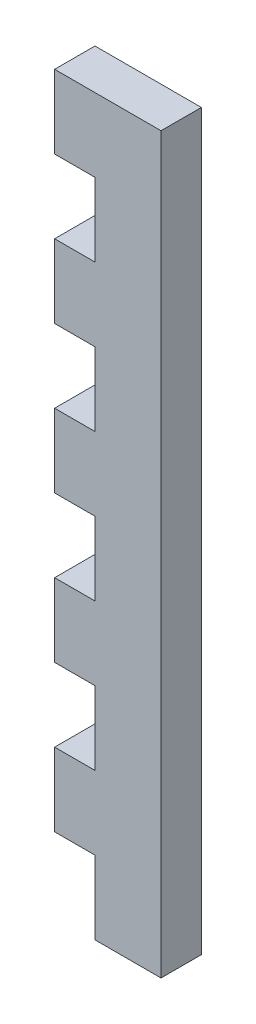
ISO-10303-21;
HEADER;
FILE_DESCRIPTION(('STEP AP214'),'2;1');
FILE_NAME('part.step','',(''),(''),'','','');
FILE_SCHEMA(('AUTOMOTIVE_DESIGN { 1 0 10303 214 1 1 1 1 }'));
ENDSEC;
DATA;
#1=APPLICATION_CONTEXT('core data for automotive mechanical design processes');
#2=APPLICATION_PROTOCOL_DEFINITION('international standard','automotive_design',2000,#1);
#3=PRODUCT_CONTEXT('',#1,'mechanical');
#4=PRODUCT('Part','Part','',(#3));
#5=PRODUCT_RELATED_PRODUCT_CATEGORY('part','',(#4));
#6=PRODUCT_DEFINITION_FORMATION('','',#4);
#7=PRODUCT_DEFINITION_CONTEXT('part definition',#1,'design');
#8=PRODUCT_DEFINITION('design','',#6,#7);
#9=PRODUCT_DEFINITION_SHAPE('','',#8);
#10=(LENGTH_UNIT() NAMED_UNIT(*) SI_UNIT(.MILLI.,.METRE.));
#11=(NAMED_UNIT(*) PLANE_ANGLE_UNIT() SI_UNIT($,.RADIAN.));
#12=(NAMED_UNIT(*) SI_UNIT($,.STERADIAN.) SOLID_ANGLE_UNIT());
#13=UNCERTAINTY_MEASURE_WITH_UNIT(LENGTH_MEASURE(1.E-05),#10,'distance_accuracy_value','');
#14=(GEOMETRIC_REPRESENTATION_CONTEXT(3) GLOBAL_UNCERTAINTY_ASSIGNED_CONTEXT((#13)) GLOBAL_UNIT_ASSIGNED_CONTEXT((#10,
#11,#12)) REPRESENTATION_CONTEXT('',''));
#15=CARTESIAN_POINT('',(0.,0.,0.));
#16=DIRECTION('',(0.,0.,1.));
#17=DIRECTION('',(1.,0.,0.));
#18=AXIS2_PLACEMENT_3D('',#15,#16,#17);
#19=CARTESIAN_POINT('',(0.,0.,5.5));
#20=DIRECTION('',(1.,0.,0.));
#21=DIRECTION('',(0.,1.,0.));
#22=AXIS2_PLACEMENT_3D('',#19,#20,#21);
#23=PLANE('',#22);
#24=DIRECTION('',(0.,-1.,0.));
#25=VECTOR('',#24,1.);
#26=CARTESIAN_POINT('',(0.,0.,0.));
#27=LINE('',#26,#25);
#28=CARTESIAN_POINT('',(0.,0.,0.));
#29=VERTEX_POINT('',#28);
#30=CARTESIAN_POINT('',(0.,-10.,0.));
#31=VERTEX_POINT('',#30);
#32=EDGE_CURVE('E203',#29,#31,#27,.T.);
#33=ORIENTED_EDGE('',*,*,#32,.T.);
#34=DIRECTION('',(0.,0.,1.));
#35=VECTOR('',#34,1.);
#36=CARTESIAN_POINT('',(0.,-10.,0.));
#37=LINE('',#36,#35);
#38=CARTESIAN_POINT('',(0.,-10.,5.5));
#39=VERTEX_POINT('',#38);
#40=EDGE_CURVE('E240',#31,#39,#37,.T.);
#41=ORIENTED_EDGE('',*,*,#40,.T.);
#42=DIRECTION('',(0.,-1.,0.));
#43=VECTOR('',#42,1.);
#44=CARTESIAN_POINT('',(0.,0.,5.5));
#45=LINE('',#44,#43);
#46=CARTESIAN_POINT('',(0.,0.,5.5));
#47=VERTEX_POINT('',#46);
#48=EDGE_CURVE('E242',#47,#39,#45,.T.);
#49=ORIENTED_EDGE('',*,*,#48,.F.);
#50=DIRECTION('',(0.,0.,-1.));
#51=VECTOR('',#50,1.);
#52=CARTESIAN_POINT('',(0.,0.,5.5));
#53=LINE('',#52,#51);
#54=EDGE_CURVE('E221',#47,#29,#53,.T.);
#55=ORIENTED_EDGE('',*,*,#54,.T.);
#56=EDGE_LOOP('',(#33,#41,#49,#55));
#57=FACE_BOUND('',#56,.T.);
#58=ADVANCED_FACE('F33',(#57),#23,.F.);
#59=CARTESIAN_POINT('',(0.,-40.,5.5));
#60=VERTEX_POINT('',#59);
#61=CARTESIAN_POINT('',(0.,-50.,5.5));
#62=VERTEX_POINT('',#61);
#63=EDGE_CURVE('E249',#60,#62,#45,.T.);
#64=ORIENTED_EDGE('',*,*,#63,.F.);
#65=DIRECTION('',(0.,0.,1.));
#66=VECTOR('',#65,1.);
#67=CARTESIAN_POINT('',(0.,-40.,0.));
#68=LINE('',#67,#66);
#69=CARTESIAN_POINT('',(0.,-40.,0.));
#70=VERTEX_POINT('',#69);
#71=EDGE_CURVE('E274',#70,#60,#68,.T.);
#72=ORIENTED_EDGE('',*,*,#71,.F.);
#73=CARTESIAN_POINT('',(0.,-50.,0.));
#74=VERTEX_POINT('',#73);
#75=EDGE_CURVE('E204',#70,#74,#27,.T.);
#76=ORIENTED_EDGE('',*,*,#75,.T.);
#77=DIRECTION('',(0.,0.,1.));
#78=VECTOR('',#77,1.);
#79=CARTESIAN_POINT('',(0.,-50.,0.));
#80=LINE('',#79,#78);
#81=EDGE_CURVE('E276',#74,#62,#80,.T.);
#82=ORIENTED_EDGE('',*,*,#81,.T.);
#83=EDGE_LOOP('',(#64,#72,#76,#82));
#84=FACE_BOUND('',#83,.T.);
#85=ADVANCED_FACE('F273',(#84),#23,.F.);
#86=CARTESIAN_POINT('',(0.,-60.,5.5));
#87=VERTEX_POINT('',#86);
#88=CARTESIAN_POINT('',(0.,-70.,5.5));
#89=VERTEX_POINT('',#88);
#90=EDGE_CURVE('E252',#87,#89,#45,.T.);
#91=ORIENTED_EDGE('',*,*,#90,.F.);
#92=DIRECTION('',(0.,0.,1.));
#93=VECTOR('',#92,1.);
#94=CARTESIAN_POINT('',(0.,-60.,0.));
#95=LINE('',#94,#93);
#96=CARTESIAN_POINT('',(0.,-60.,0.));
#97=VERTEX_POINT('',#96);
#98=EDGE_CURVE('E279',#97,#87,#95,.T.);
#99=ORIENTED_EDGE('',*,*,#98,.F.);
#100=CARTESIAN_POINT('',(0.,-70.,0.));
#101=VERTEX_POINT('',#100);
#102=EDGE_CURVE('E210',#97,#101,#27,.T.);
#103=ORIENTED_EDGE('',*,*,#102,.T.);
#104=DIRECTION('',(0.,0.,1.));
#105=VECTOR('',#104,1.);
#106=CARTESIAN_POINT('',(0.,-70.,0.));
#107=LINE('',#106,#105);
#108=EDGE_CURVE('E311',#101,#89,#107,.T.);
#109=ORIENTED_EDGE('',*,*,#108,.T.);
#110=EDGE_LOOP('',(#91,#99,#103,#109));
#111=FACE_BOUND('',#110,.T.);
#112=ADVANCED_FACE('F353',(#111),#23,.F.);
#113=CARTESIAN_POINT('',(0.,-80.,5.5));
#114=VERTEX_POINT('',#113);
#115=CARTESIAN_POINT('',(0.,-90.,5.5));
#116=VERTEX_POINT('',#115);
#117=EDGE_CURVE('E220',#114,#116,#45,.T.);
#118=ORIENTED_EDGE('',*,*,#117,.F.);
#119=DIRECTION('',(0.,0.,1.));
#120=VECTOR('',#119,1.);
#121=CARTESIAN_POINT('',(0.,-80.,0.));
#122=LINE('',#121,#120);
#123=CARTESIAN_POINT('',(0.,-80.,0.));
#124=VERTEX_POINT('',#123);
#125=EDGE_CURVE('E308',#124,#114,#122,.T.);
#126=ORIENTED_EDGE('',*,*,#125,.F.);
#127=CARTESIAN_POINT('',(0.,-90.,0.));
#128=VERTEX_POINT('',#127);
#129=EDGE_CURVE('E208',#124,#128,#27,.T.);
#130=ORIENTED_EDGE('',*,*,#129,.T.);
#131=DIRECTION('',(0.,0.,1.));
#132=VECTOR('',#131,1.);
#133=CARTESIAN_POINT('',(0.,-90.,0.));
#134=LINE('',#133,#132);
#135=EDGE_CURVE('E304',#128,#116,#134,.T.);
#136=ORIENTED_EDGE('',*,*,#135,.T.);
#137=EDGE_LOOP('',(#118,#126,#130,#136));
#138=FACE_BOUND('',#137,.T.);
#139=ADVANCED_FACE('F355',(#138),#23,.F.);
#140=CARTESIAN_POINT('',(0.,-20.,5.5));
#141=VERTEX_POINT('',#140);
#142=CARTESIAN_POINT('',(0.,-30.,5.5));
#143=VERTEX_POINT('',#142);
#144=EDGE_CURVE('E198',#141,#143,#45,.T.);
#145=ORIENTED_EDGE('',*,*,#144,.F.);
#146=DIRECTION('',(0.,0.,1.));
#147=VECTOR('',#146,1.);
#148=CARTESIAN_POINT('',(0.,-20.,0.));
#149=LINE('',#148,#147);
#150=CARTESIAN_POINT('',(0.,-20.,0.));
#151=VERTEX_POINT('',#150);
#152=EDGE_CURVE('E185',#151,#141,#149,.T.);
#153=ORIENTED_EDGE('',*,*,#152,.F.);
#154=CARTESIAN_POINT('',(0.,-30.,0.));
#155=VERTEX_POINT('',#154);
#156=EDGE_CURVE('E196',#151,#155,#27,.T.);
#157=ORIENTED_EDGE('',*,*,#156,.T.);
#158=DIRECTION('',(0.,0.,1.));
#159=VECTOR('',#158,1.);
#160=CARTESIAN_POINT('',(0.,-30.,0.));
#161=LINE('',#160,#159);
#162=EDGE_CURVE('E392',#155,#143,#161,.T.);
#163=ORIENTED_EDGE('',*,*,#162,.T.);
#164=EDGE_LOOP('',(#145,#153,#157,#163));
#165=FACE_BOUND('',#164,.T.);
#166=ADVANCED_FACE('F35',(#165),#23,.F.);
#167=CARTESIAN_POINT('',(0.,-100.,5.5));
#168=DIRECTION('',(0.,1.,0.));
#169=DIRECTION('',(0.,0.,1.));
#170=AXIS2_PLACEMENT_3D('',#167,#168,#169);
#171=PLANE('',#170);
#172=DIRECTION('',(1.,0.,0.));
#173=VECTOR('',#172,1.);
#174=CARTESIAN_POINT('',(0.,-100.,5.5));
#175=LINE('',#174,#173);
#176=CARTESIAN_POINT('',(5.50000000000001,-100.,5.5));
#177=VERTEX_POINT('',#176);
#178=CARTESIAN_POINT('',(14.5,-100.,5.5));
#179=VERTEX_POINT('',#178);
#180=EDGE_CURVE('E245',#177,#179,#175,.T.);
#181=ORIENTED_EDGE('',*,*,#180,.F.);
#182=DIRECTION('',(0.,0.,1.));
#183=VECTOR('',#182,1.);
#184=CARTESIAN_POINT('',(5.50000000000001,-100.,0.));
#185=LINE('',#184,#183);
#186=CARTESIAN_POINT('',(5.50000000000001,-100.,0.));
#187=VERTEX_POINT('',#186);
#188=EDGE_CURVE('E324',#187,#177,#185,.T.);
#189=ORIENTED_EDGE('',*,*,#188,.F.);
#190=DIRECTION('',(1.,0.,0.));
#191=VECTOR('',#190,1.);
#192=CARTESIAN_POINT('',(0.,-100.,0.));
#193=LINE('',#192,#191);
#194=CARTESIAN_POINT('',(14.5,-100.,0.));
#195=VERTEX_POINT('',#194);
#196=EDGE_CURVE('E207',#187,#195,#193,.T.);
#197=ORIENTED_EDGE('',*,*,#196,.T.);
#198=DIRECTION('',(0.,0.,-1.));
#199=VECTOR('',#198,1.);
#200=CARTESIAN_POINT('',(14.5,-100.,5.5));
#201=LINE('',#200,#199);
#202=EDGE_CURVE('E11',#179,#195,#201,.T.);
#203=ORIENTED_EDGE('',*,*,#202,.F.);
#204=EDGE_LOOP('',(#181,#189,#197,#203));
#205=FACE_BOUND('',#204,.T.);
#206=ADVANCED_FACE('F340',(#205),#171,.F.);
#207=CARTESIAN_POINT('',(14.5,0.,5.5));
#208=DIRECTION('',(-1.,0.,0.));
#209=DIRECTION('',(0.,-1.,0.));
#210=AXIS2_PLACEMENT_3D('',#207,#208,#209);
#211=PLANE('',#210);
#212=DIRECTION('',(0.,1.,0.));
#213=VECTOR('',#212,1.);
#214=CARTESIAN_POINT('',(14.5,0.,0.));
#215=LINE('',#214,#213);
#216=CARTESIAN_POINT('',(14.5,0.,0.));
#217=VERTEX_POINT('',#216);
#218=EDGE_CURVE('E216',#195,#217,#215,.T.);
#219=ORIENTED_EDGE('',*,*,#218,.T.);
#220=DIRECTION('',(0.,0.,-1.));
#221=VECTOR('',#220,1.);
#222=CARTESIAN_POINT('',(14.5,0.,5.5));
#223=LINE('',#222,#221);
#224=CARTESIAN_POINT('',(14.5,0.,5.5));
#225=VERTEX_POINT('',#224);
#226=EDGE_CURVE('E41',#225,#217,#223,.T.);
#227=ORIENTED_EDGE('',*,*,#226,.F.);
#228=DIRECTION('',(0.,1.,0.));
#229=VECTOR('',#228,1.);
#230=CARTESIAN_POINT('',(14.5,0.,5.5));
#231=LINE('',#230,#229);
#232=EDGE_CURVE('E247',#179,#225,#231,.T.);
#233=ORIENTED_EDGE('',*,*,#232,.F.);
#234=ORIENTED_EDGE('',*,*,#202,.T.);
#235=EDGE_LOOP('',(#219,#227,#233,#234));
#236=FACE_BOUND('',#235,.T.);
#237=ADVANCED_FACE('F341',(#236),#211,.F.);
#238=CARTESIAN_POINT('',(0.,0.,5.5));
#239=DIRECTION('',(0.,-1.,0.));
#240=DIRECTION('',(0.,0.,-1.));
#241=AXIS2_PLACEMENT_3D('',#238,#239,#240);
#242=PLANE('',#241);
#243=DIRECTION('',(-1.,0.,0.));
#244=VECTOR('',#243,1.);
#245=CARTESIAN_POINT('',(0.,0.,0.));
#246=LINE('',#245,#244);
#247=EDGE_CURVE('E218',#217,#29,#246,.T.);
#248=ORIENTED_EDGE('',*,*,#247,.T.);
#249=ORIENTED_EDGE('',*,*,#54,.F.);
#250=DIRECTION('',(-1.,0.,0.));
#251=VECTOR('',#250,1.);
#252=CARTESIAN_POINT('',(0.,0.,5.5));
#253=LINE('',#252,#251);
#254=EDGE_CURVE('E213',#225,#47,#253,.T.);
#255=ORIENTED_EDGE('',*,*,#254,.F.);
#256=ORIENTED_EDGE('',*,*,#226,.T.);
#257=EDGE_LOOP('',(#248,#249,#255,#256));
#258=FACE_BOUND('',#257,.T.);
#259=ADVANCED_FACE('F228',(#258),#242,.F.);
#260=CARTESIAN_POINT('',(0.,0.,5.5));
#261=DIRECTION('',(0.,0.,1.));
#262=DIRECTION('',(1.,0.,0.));
#263=AXIS2_PLACEMENT_3D('',#260,#261,#262);
#264=PLANE('',#263);
#265=DIRECTION('',(-1.,0.,0.));
#266=VECTOR('',#265,1.);
#267=CARTESIAN_POINT('',(0.,-10.,5.5));
#268=LINE('',#267,#266);
#269=CARTESIAN_POINT('',(5.5,-10.,5.5));
#270=VERTEX_POINT('',#269);
#271=EDGE_CURVE('E190',#270,#39,#268,.T.);
#272=ORIENTED_EDGE('',*,*,#271,.F.);
#273=DIRECTION('',(0.,1.,0.));
#274=VECTOR('',#273,1.);
#275=CARTESIAN_POINT('',(5.5,-20.,5.5));
#276=LINE('',#275,#274);
#277=CARTESIAN_POINT('',(5.5,-20.,5.5));
#278=VERTEX_POINT('',#277);
#279=EDGE_CURVE('E556',#278,#270,#276,.T.);
#280=ORIENTED_EDGE('',*,*,#279,.F.);
#281=DIRECTION('',(1.,0.,0.));
#282=VECTOR('',#281,1.);
#283=CARTESIAN_POINT('',(0.,-20.,5.5));
#284=LINE('',#283,#282);
#285=EDGE_CURVE('E391',#141,#278,#284,.T.);
#286=ORIENTED_EDGE('',*,*,#285,.F.);
#287=ORIENTED_EDGE('',*,*,#144,.T.);
#288=DIRECTION('',(-1.,0.,0.));
#289=VECTOR('',#288,1.);
#290=CARTESIAN_POINT('',(0.,-30.,5.5));
#291=LINE('',#290,#289);
#292=CARTESIAN_POINT('',(5.5,-30.,5.5));
#293=VERTEX_POINT('',#292);
#294=EDGE_CURVE('E381',#293,#143,#291,.T.);
#295=ORIENTED_EDGE('',*,*,#294,.F.);
#296=DIRECTION('',(0.,1.,0.));
#297=VECTOR('',#296,1.);
#298=CARTESIAN_POINT('',(5.5,-40.,5.5));
#299=LINE('',#298,#297);
#300=CARTESIAN_POINT('',(5.5,-40.,5.5));
#301=VERTEX_POINT('',#300);
#302=EDGE_CURVE('E386',#301,#293,#299,.T.);
#303=ORIENTED_EDGE('',*,*,#302,.F.);
#304=DIRECTION('',(1.,0.,0.));
#305=VECTOR('',#304,1.);
#306=CARTESIAN_POINT('',(0.,-40.,5.5));
#307=LINE('',#306,#305);
#308=EDGE_CURVE('E269',#60,#301,#307,.T.);
#309=ORIENTED_EDGE('',*,*,#308,.F.);
#310=ORIENTED_EDGE('',*,*,#63,.T.);
#311=DIRECTION('',(-1.,0.,0.));
#312=VECTOR('',#311,1.);
#313=CARTESIAN_POINT('',(0.,-50.,5.5));
#314=LINE('',#313,#312);
#315=CARTESIAN_POINT('',(5.50000000000001,-50.,5.5));
#316=VERTEX_POINT('',#315);
#317=EDGE_CURVE('E266',#316,#62,#314,.T.);
#318=ORIENTED_EDGE('',*,*,#317,.F.);
#319=DIRECTION('',(0.,1.,0.));
#320=VECTOR('',#319,1.);
#321=CARTESIAN_POINT('',(5.50000000000001,-60.,5.5));
#322=LINE('',#321,#320);
#323=CARTESIAN_POINT('',(5.50000000000001,-60.,5.5));
#324=VERTEX_POINT('',#323);
#325=EDGE_CURVE('E406',#324,#316,#322,.T.);
#326=ORIENTED_EDGE('',*,*,#325,.F.);
#327=DIRECTION('',(1.,0.,0.));
#328=VECTOR('',#327,1.);
#329=CARTESIAN_POINT('',(0.,-60.,5.5));
#330=LINE('',#329,#328);
#331=EDGE_CURVE('E310',#87,#324,#330,.T.);
#332=ORIENTED_EDGE('',*,*,#331,.F.);
#333=ORIENTED_EDGE('',*,*,#90,.T.);
#334=DIRECTION('',(-1.,0.,0.));
#335=VECTOR('',#334,1.);
#336=CARTESIAN_POINT('',(0.,-70.,5.5));
#337=LINE('',#336,#335);
#338=CARTESIAN_POINT('',(5.50000000000001,-70.,5.5));
#339=VERTEX_POINT('',#338);
#340=EDGE_CURVE('E293',#339,#89,#337,.T.);
#341=ORIENTED_EDGE('',*,*,#340,.F.);
#342=DIRECTION('',(0.,1.,0.));
#343=VECTOR('',#342,1.);
#344=CARTESIAN_POINT('',(5.50000000000001,-80.,5.5));
#345=LINE('',#344,#343);
#346=CARTESIAN_POINT('',(5.50000000000001,-80.,5.5));
#347=VERTEX_POINT('',#346);
#348=EDGE_CURVE('E303',#347,#339,#345,.T.);
#349=ORIENTED_EDGE('',*,*,#348,.F.);
#350=DIRECTION('',(1.,0.,0.));
#351=VECTOR('',#350,1.);
#352=CARTESIAN_POINT('',(0.,-80.,5.5));
#353=LINE('',#352,#351);
#354=EDGE_CURVE('E300',#114,#347,#353,.T.);
#355=ORIENTED_EDGE('',*,*,#354,.F.);
#356=ORIENTED_EDGE('',*,*,#117,.T.);
#357=DIRECTION('',(-1.,0.,0.));
#358=VECTOR('',#357,1.);
#359=CARTESIAN_POINT('',(0.,-90.,5.5));
#360=LINE('',#359,#358);
#361=CARTESIAN_POINT('',(5.50000000000001,-90.,5.5));
#362=VERTEX_POINT('',#361);
#363=EDGE_CURVE('E321',#362,#116,#360,.T.);
#364=ORIENTED_EDGE('',*,*,#363,.F.);
#365=DIRECTION('',(0.,1.,0.));
#366=VECTOR('',#365,1.);
#367=CARTESIAN_POINT('',(5.50000000000001,-100.,5.5));
#368=LINE('',#367,#366);
#369=EDGE_CURVE('E325',#177,#362,#368,.T.);
#370=ORIENTED_EDGE('',*,*,#369,.F.);
#371=ORIENTED_EDGE('',*,*,#180,.T.);
#372=ORIENTED_EDGE('',*,*,#232,.T.);
#373=ORIENTED_EDGE('',*,*,#254,.T.);
#374=ORIENTED_EDGE('',*,*,#48,.T.);
#375=EDGE_LOOP('',(#272,#280,#286,#287,#295,#303,#309,#310,#318,#326,#332,#333,#341,#349,#355,
#356,#364,#370,#371,#372,#373,#374));
#376=FACE_BOUND('',#375,.T.);
#377=ADVANCED_FACE('F264',(#376),#264,.T.);
#378=CARTESIAN_POINT('',(0.,0.,0.));
#379=DIRECTION('',(0.,0.,1.));
#380=DIRECTION('',(1.,0.,0.));
#381=AXIS2_PLACEMENT_3D('',#378,#379,#380);
#382=PLANE('',#381);
#383=DIRECTION('',(0.,1.,0.));
#384=VECTOR('',#383,1.);
#385=CARTESIAN_POINT('',(5.5,-20.,0.));
#386=LINE('',#385,#384);
#387=CARTESIAN_POINT('',(5.5,-20.,0.));
#388=VERTEX_POINT('',#387);
#389=CARTESIAN_POINT('',(5.5,-10.,0.));
#390=VERTEX_POINT('',#389);
#391=EDGE_CURVE('E48',#388,#390,#386,.T.);
#392=ORIENTED_EDGE('',*,*,#391,.T.);
#393=DIRECTION('',(-1.,0.,0.));
#394=VECTOR('',#393,1.);
#395=CARTESIAN_POINT('',(0.,-10.,0.));
#396=LINE('',#395,#394);
#397=EDGE_CURVE('E199',#390,#31,#396,.T.);
#398=ORIENTED_EDGE('',*,*,#397,.T.);
#399=ORIENTED_EDGE('',*,*,#32,.F.);
#400=ORIENTED_EDGE('',*,*,#247,.F.);
#401=ORIENTED_EDGE('',*,*,#218,.F.);
#402=ORIENTED_EDGE('',*,*,#196,.F.);
#403=DIRECTION('',(0.,1.,0.));
#404=VECTOR('',#403,1.);
#405=CARTESIAN_POINT('',(5.50000000000001,-100.,0.));
#406=LINE('',#405,#404);
#407=CARTESIAN_POINT('',(5.50000000000001,-90.,0.));
#408=VERTEX_POINT('',#407);
#409=EDGE_CURVE('E317',#187,#408,#406,.T.);
#410=ORIENTED_EDGE('',*,*,#409,.T.);
#411=DIRECTION('',(-1.,0.,0.));
#412=VECTOR('',#411,1.);
#413=CARTESIAN_POINT('',(0.,-90.,0.));
#414=LINE('',#413,#412);
#415=EDGE_CURVE('E320',#408,#128,#414,.T.);
#416=ORIENTED_EDGE('',*,*,#415,.T.);
#417=ORIENTED_EDGE('',*,*,#129,.F.);
#418=DIRECTION('',(1.,0.,0.));
#419=VECTOR('',#418,1.);
#420=CARTESIAN_POINT('',(0.,-80.,0.));
#421=LINE('',#420,#419);
#422=CARTESIAN_POINT('',(5.50000000000001,-80.,0.));
#423=VERTEX_POINT('',#422);
#424=EDGE_CURVE('E289',#124,#423,#421,.T.);
#425=ORIENTED_EDGE('',*,*,#424,.T.);
#426=DIRECTION('',(0.,1.,0.));
#427=VECTOR('',#426,1.);
#428=CARTESIAN_POINT('',(5.50000000000001,-80.,0.));
#429=LINE('',#428,#427);
#430=CARTESIAN_POINT('',(5.50000000000001,-70.,0.));
#431=VERTEX_POINT('',#430);
#432=EDGE_CURVE('E292',#423,#431,#429,.T.);
#433=ORIENTED_EDGE('',*,*,#432,.T.);
#434=DIRECTION('',(-1.,0.,0.));
#435=VECTOR('',#434,1.);
#436=CARTESIAN_POINT('',(0.,-70.,0.));
#437=LINE('',#436,#435);
#438=EDGE_CURVE('E296',#431,#101,#437,.T.);
#439=ORIENTED_EDGE('',*,*,#438,.T.);
#440=ORIENTED_EDGE('',*,*,#102,.F.);
#441=DIRECTION('',(1.,0.,0.));
#442=VECTOR('',#441,1.);
#443=CARTESIAN_POINT('',(0.,-60.,0.));
#444=LINE('',#443,#442);
#445=CARTESIAN_POINT('',(5.50000000000001,-60.,0.));
#446=VERTEX_POINT('',#445);
#447=EDGE_CURVE('E397',#97,#446,#444,.T.);
#448=ORIENTED_EDGE('',*,*,#447,.T.);
#449=DIRECTION('',(0.,1.,0.));
#450=VECTOR('',#449,1.);
#451=CARTESIAN_POINT('',(5.50000000000001,-60.,0.));
#452=LINE('',#451,#450);
#453=CARTESIAN_POINT('',(5.50000000000001,-50.,0.));
#454=VERTEX_POINT('',#453);
#455=EDGE_CURVE('E400',#446,#454,#452,.T.);
#456=ORIENTED_EDGE('',*,*,#455,.T.);
#457=DIRECTION('',(-1.,0.,0.));
#458=VECTOR('',#457,1.);
#459=CARTESIAN_POINT('',(0.,-50.,0.));
#460=LINE('',#459,#458);
#461=EDGE_CURVE('E288',#454,#74,#460,.T.);
#462=ORIENTED_EDGE('',*,*,#461,.T.);
#463=ORIENTED_EDGE('',*,*,#75,.F.);
#464=DIRECTION('',(1.,0.,0.));
#465=VECTOR('',#464,1.);
#466=CARTESIAN_POINT('',(0.,-40.,0.));
#467=LINE('',#466,#465);
#468=CARTESIAN_POINT('',(5.5,-40.,0.));
#469=VERTEX_POINT('',#468);
#470=EDGE_CURVE('E377',#70,#469,#467,.T.);
#471=ORIENTED_EDGE('',*,*,#470,.T.);
#472=DIRECTION('',(0.,1.,0.));
#473=VECTOR('',#472,1.);
#474=CARTESIAN_POINT('',(5.5,-40.,0.));
#475=LINE('',#474,#473);
#476=CARTESIAN_POINT('',(5.5,-30.,0.));
#477=VERTEX_POINT('',#476);
#478=EDGE_CURVE('E380',#469,#477,#475,.T.);
#479=ORIENTED_EDGE('',*,*,#478,.T.);
#480=DIRECTION('',(-1.,0.,0.));
#481=VECTOR('',#480,1.);
#482=CARTESIAN_POINT('',(0.,-30.,0.));
#483=LINE('',#482,#481);
#484=EDGE_CURVE('E56',#477,#155,#483,.T.);
#485=ORIENTED_EDGE('',*,*,#484,.T.);
#486=ORIENTED_EDGE('',*,*,#156,.F.);
#487=DIRECTION('',(1.,0.,0.));
#488=VECTOR('',#487,1.);
#489=CARTESIAN_POINT('',(0.,-20.,0.));
#490=LINE('',#489,#488);
#491=EDGE_CURVE('E181',#151,#388,#490,.T.);
#492=ORIENTED_EDGE('',*,*,#491,.T.);
#493=EDGE_LOOP('',(#392,#398,#399,#400,#401,#402,#410,#416,#417,#425,#433,#439,#440,#448,#456,
#462,#463,#471,#479,#485,#486,#492));
#494=FACE_BOUND('',#493,.T.);
#495=ADVANCED_FACE('F201',(#494),#382,.F.);
#496=CARTESIAN_POINT('',(0.,-90.,0.));
#497=DIRECTION('',(0.,1.,0.));
#498=DIRECTION('',(-1.,0.,0.));
#499=AXIS2_PLACEMENT_3D('',#496,#497,#498);
#500=PLANE('',#499);
#501=ORIENTED_EDGE('',*,*,#363,.T.);
#502=ORIENTED_EDGE('',*,*,#135,.F.);
#503=ORIENTED_EDGE('',*,*,#415,.F.);
#504=DIRECTION('',(0.,0.,1.));
#505=VECTOR('',#504,1.);
#506=CARTESIAN_POINT('',(5.50000000000001,-90.,0.));
#507=LINE('',#506,#505);
#508=EDGE_CURVE('E331',#408,#362,#507,.T.);
#509=ORIENTED_EDGE('',*,*,#508,.T.);
#510=EDGE_LOOP('',(#501,#502,#503,#509));
#511=FACE_BOUND('',#510,.T.);
#512=ADVANCED_FACE('F368',(#511),#500,.F.);
#513=CARTESIAN_POINT('',(5.50000000000001,-100.,0.));
#514=DIRECTION('',(1.,0.,0.));
#515=DIRECTION('',(0.,0.,-1.));
#516=AXIS2_PLACEMENT_3D('',#513,#514,#515);
#517=PLANE('',#516);
#518=ORIENTED_EDGE('',*,*,#369,.T.);
#519=ORIENTED_EDGE('',*,*,#508,.F.);
#520=ORIENTED_EDGE('',*,*,#409,.F.);
#521=ORIENTED_EDGE('',*,*,#188,.T.);
#522=EDGE_LOOP('',(#518,#519,#520,#521));
#523=FACE_BOUND('',#522,.T.);
#524=ADVANCED_FACE('F335',(#523),#517,.F.);
#525=CARTESIAN_POINT('',(0.,-80.,0.));
#526=DIRECTION('',(0.,-1.,0.));
#527=DIRECTION('',(1.,0.,0.));
#528=AXIS2_PLACEMENT_3D('',#525,#526,#527);
#529=PLANE('',#528);
#530=ORIENTED_EDGE('',*,*,#354,.T.);
#531=DIRECTION('',(0.,0.,1.));
#532=VECTOR('',#531,1.);
#533=CARTESIAN_POINT('',(5.50000000000001,-80.,0.));
#534=LINE('',#533,#532);
#535=EDGE_CURVE('E299',#423,#347,#534,.T.);
#536=ORIENTED_EDGE('',*,*,#535,.F.);
#537=ORIENTED_EDGE('',*,*,#424,.F.);
#538=ORIENTED_EDGE('',*,*,#125,.T.);
#539=EDGE_LOOP('',(#530,#536,#537,#538));
#540=FACE_BOUND('',#539,.T.);
#541=ADVANCED_FACE('F424',(#540),#529,.F.);
#542=CARTESIAN_POINT('',(0.,-70.,0.));
#543=DIRECTION('',(0.,1.,0.));
#544=DIRECTION('',(0.,0.,1.));
#545=AXIS2_PLACEMENT_3D('',#542,#543,#544);
#546=PLANE('',#545);
#547=ORIENTED_EDGE('',*,*,#340,.T.);
#548=ORIENTED_EDGE('',*,*,#108,.F.);
#549=ORIENTED_EDGE('',*,*,#438,.F.);
#550=DIRECTION('',(0.,0.,1.));
#551=VECTOR('',#550,1.);
#552=CARTESIAN_POINT('',(5.50000000000001,-70.,0.));
#553=LINE('',#552,#551);
#554=EDGE_CURVE('E314',#431,#339,#553,.T.);
#555=ORIENTED_EDGE('',*,*,#554,.T.);
#556=EDGE_LOOP('',(#547,#548,#549,#555));
#557=FACE_BOUND('',#556,.T.);
#558=ADVANCED_FACE('F417',(#557),#546,.F.);
#559=CARTESIAN_POINT('',(5.50000000000001,-80.,0.));
#560=DIRECTION('',(1.,0.,0.));
#561=DIRECTION('',(0.,0.,-1.));
#562=AXIS2_PLACEMENT_3D('',#559,#560,#561);
#563=PLANE('',#562);
#564=ORIENTED_EDGE('',*,*,#348,.T.);
#565=ORIENTED_EDGE('',*,*,#554,.F.);
#566=ORIENTED_EDGE('',*,*,#432,.F.);
#567=ORIENTED_EDGE('',*,*,#535,.T.);
#568=EDGE_LOOP('',(#564,#565,#566,#567));
#569=FACE_BOUND('',#568,.T.);
#570=ADVANCED_FACE('F421',(#569),#563,.F.);
#571=CARTESIAN_POINT('',(0.,-60.,0.));
#572=DIRECTION('',(0.,-1.,0.));
#573=DIRECTION('',(0.,0.,-1.));
#574=AXIS2_PLACEMENT_3D('',#571,#572,#573);
#575=PLANE('',#574);
#576=ORIENTED_EDGE('',*,*,#331,.T.);
#577=DIRECTION('',(0.,0.,1.));
#578=VECTOR('',#577,1.);
#579=CARTESIAN_POINT('',(5.50000000000001,-60.,0.));
#580=LINE('',#579,#578);
#581=EDGE_CURVE('E283',#446,#324,#580,.T.);
#582=ORIENTED_EDGE('',*,*,#581,.F.);
#583=ORIENTED_EDGE('',*,*,#447,.F.);
#584=ORIENTED_EDGE('',*,*,#98,.T.);
#585=EDGE_LOOP('',(#576,#582,#583,#584));
#586=FACE_BOUND('',#585,.T.);
#587=ADVANCED_FACE('F471',(#586),#575,.F.);
#588=CARTESIAN_POINT('',(0.,-50.,0.));
#589=DIRECTION('',(0.,1.,0.));
#590=DIRECTION('',(-1.,0.,0.));
#591=AXIS2_PLACEMENT_3D('',#588,#589,#590);
#592=PLANE('',#591);
#593=ORIENTED_EDGE('',*,*,#317,.T.);
#594=ORIENTED_EDGE('',*,*,#81,.F.);
#595=ORIENTED_EDGE('',*,*,#461,.F.);
#596=DIRECTION('',(0.,0.,1.));
#597=VECTOR('',#596,1.);
#598=CARTESIAN_POINT('',(5.50000000000001,-50.,0.));
#599=LINE('',#598,#597);
#600=EDGE_CURVE('E280',#454,#316,#599,.T.);
#601=ORIENTED_EDGE('',*,*,#600,.T.);
#602=EDGE_LOOP('',(#593,#594,#595,#601));
#603=FACE_BOUND('',#602,.T.);
#604=ADVANCED_FACE('F408',(#603),#592,.F.);
#605=CARTESIAN_POINT('',(5.50000000000001,-60.,0.));
#606=DIRECTION('',(1.,0.,0.));
#607=DIRECTION('',(0.,0.,-1.));
#608=AXIS2_PLACEMENT_3D('',#605,#606,#607);
#609=PLANE('',#608);
#610=ORIENTED_EDGE('',*,*,#325,.T.);
#611=ORIENTED_EDGE('',*,*,#600,.F.);
#612=ORIENTED_EDGE('',*,*,#455,.F.);
#613=ORIENTED_EDGE('',*,*,#581,.T.);
#614=EDGE_LOOP('',(#610,#611,#612,#613));
#615=FACE_BOUND('',#614,.T.);
#616=ADVANCED_FACE('F412',(#615),#609,.F.);
#617=CARTESIAN_POINT('',(0.,-40.,0.));
#618=DIRECTION('',(0.,-1.,0.));
#619=DIRECTION('',(1.,0.,0.));
#620=AXIS2_PLACEMENT_3D('',#617,#618,#619);
#621=PLANE('',#620);
#622=ORIENTED_EDGE('',*,*,#308,.T.);
#623=DIRECTION('',(0.,0.,1.));
#624=VECTOR('',#623,1.);
#625=CARTESIAN_POINT('',(5.5,-40.,0.));
#626=LINE('',#625,#624);
#627=EDGE_CURVE('E384',#469,#301,#626,.T.);
#628=ORIENTED_EDGE('',*,*,#627,.F.);
#629=ORIENTED_EDGE('',*,*,#470,.F.);
#630=ORIENTED_EDGE('',*,*,#71,.T.);
#631=EDGE_LOOP('',(#622,#628,#629,#630));
#632=FACE_BOUND('',#631,.T.);
#633=ADVANCED_FACE('F495',(#632),#621,.F.);
#634=CARTESIAN_POINT('',(0.,-30.,0.));
#635=DIRECTION('',(0.,1.,0.));
#636=DIRECTION('',(0.,0.,1.));
#637=AXIS2_PLACEMENT_3D('',#634,#635,#636);
#638=PLANE('',#637);
#639=ORIENTED_EDGE('',*,*,#294,.T.);
#640=ORIENTED_EDGE('',*,*,#162,.F.);
#641=ORIENTED_EDGE('',*,*,#484,.F.);
#642=DIRECTION('',(0.,0.,1.));
#643=VECTOR('',#642,1.);
#644=CARTESIAN_POINT('',(5.5,-30.,0.));
#645=LINE('',#644,#643);
#646=EDGE_CURVE('E394',#477,#293,#645,.T.);
#647=ORIENTED_EDGE('',*,*,#646,.T.);
#648=EDGE_LOOP('',(#639,#640,#641,#647));
#649=FACE_BOUND('',#648,.T.);
#650=ADVANCED_FACE('F504',(#649),#638,.F.);
#651=CARTESIAN_POINT('',(5.5,-40.,0.));
#652=DIRECTION('',(1.,0.,0.));
#653=DIRECTION('',(0.,0.,-1.));
#654=AXIS2_PLACEMENT_3D('',#651,#652,#653);
#655=PLANE('',#654);
#656=ORIENTED_EDGE('',*,*,#302,.T.);
#657=ORIENTED_EDGE('',*,*,#646,.F.);
#658=ORIENTED_EDGE('',*,*,#478,.F.);
#659=ORIENTED_EDGE('',*,*,#627,.T.);
#660=EDGE_LOOP('',(#656,#657,#658,#659));
#661=FACE_BOUND('',#660,.T.);
#662=ADVANCED_FACE('F514',(#661),#655,.F.);
#663=CARTESIAN_POINT('',(0.,-10.,0.));
#664=DIRECTION('',(0.,1.,0.));
#665=DIRECTION('',(0.,0.,1.));
#666=AXIS2_PLACEMENT_3D('',#663,#664,#665);
#667=PLANE('',#666);
#668=ORIENTED_EDGE('',*,*,#271,.T.);
#669=ORIENTED_EDGE('',*,*,#40,.F.);
#670=ORIENTED_EDGE('',*,*,#397,.F.);
#671=DIRECTION('',(0.,0.,1.));
#672=VECTOR('',#671,1.);
#673=CARTESIAN_POINT('',(5.5,-10.,0.));
#674=LINE('',#673,#672);
#675=EDGE_CURVE('E370',#390,#270,#674,.T.);
#676=ORIENTED_EDGE('',*,*,#675,.T.);
#677=EDGE_LOOP('',(#668,#669,#670,#676));
#678=FACE_BOUND('',#677,.T.);
#679=ADVANCED_FACE('F523',(#678),#667,.F.);
#680=CARTESIAN_POINT('',(5.5,-20.,0.));
#681=DIRECTION('',(1.,0.,0.));
#682=DIRECTION('',(0.,0.,-1.));
#683=AXIS2_PLACEMENT_3D('',#680,#681,#682);
#684=PLANE('',#683);
#685=ORIENTED_EDGE('',*,*,#279,.T.);
#686=ORIENTED_EDGE('',*,*,#675,.F.);
#687=ORIENTED_EDGE('',*,*,#391,.F.);
#688=DIRECTION('',(0.,0.,1.));
#689=VECTOR('',#688,1.);
#690=CARTESIAN_POINT('',(5.5,-20.,0.));
#691=LINE('',#690,#689);
#692=EDGE_CURVE('E187',#388,#278,#691,.T.);
#693=ORIENTED_EDGE('',*,*,#692,.T.);
#694=EDGE_LOOP('',(#685,#686,#687,#693));
#695=FACE_BOUND('',#694,.T.);
#696=ADVANCED_FACE('F533',(#695),#684,.F.);
#697=CARTESIAN_POINT('',(0.,-20.,0.));
#698=DIRECTION('',(0.,-1.,0.));
#699=DIRECTION('',(0.,0.,-1.));
#700=AXIS2_PLACEMENT_3D('',#697,#698,#699);
#701=PLANE('',#700);
#702=ORIENTED_EDGE('',*,*,#285,.T.);
#703=ORIENTED_EDGE('',*,*,#692,.F.);
#704=ORIENTED_EDGE('',*,*,#491,.F.);
#705=ORIENTED_EDGE('',*,*,#152,.T.);
#706=EDGE_LOOP('',(#702,#703,#704,#705));
#707=FACE_BOUND('',#706,.T.);
#708=ADVANCED_FACE('F184',(#707),#701,.F.);
#709=CLOSED_SHELL('',(#58,#85,#112,#139,#166,#206,#237,#259,#377,#495,#512,#524,#541,#558,#570,
#587,#604,#616,#633,#650,#662,#679,#696,#708));
#710=MANIFOLD_SOLID_BREP('B2',#709);
#711=ADVANCED_BREP_SHAPE_REPRESENTATION('',(#18,#710),#14);
#712=SHAPE_DEFINITION_REPRESENTATION(#9,#711);
ENDSEC;
END-ISO-10303-21;
